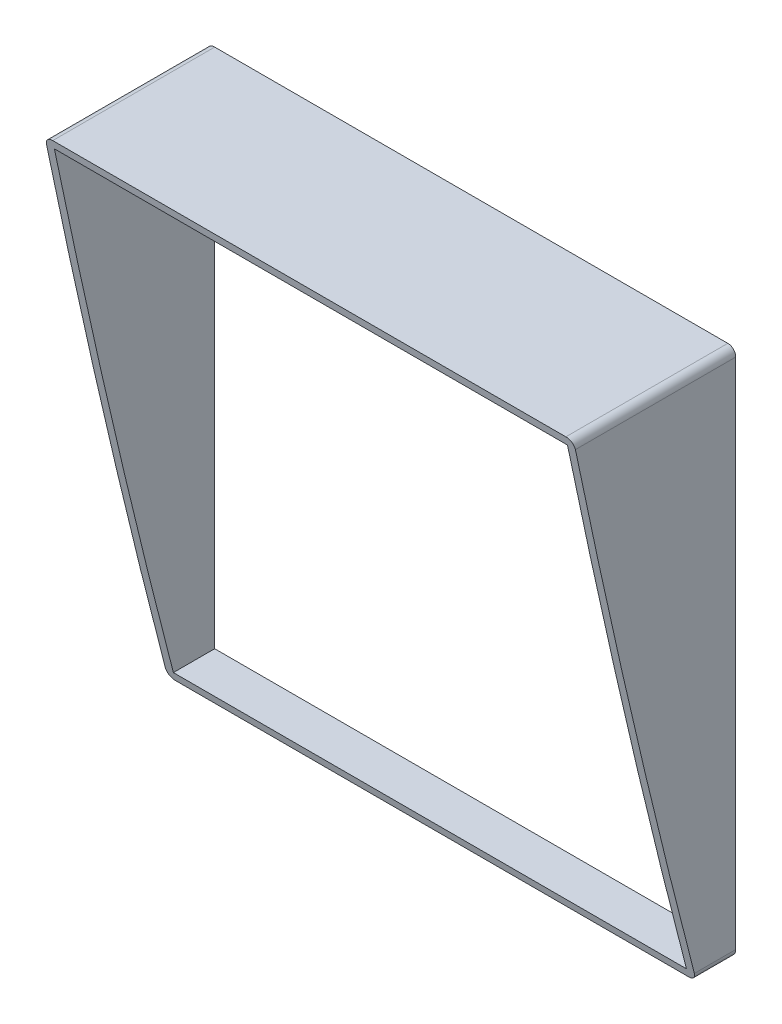
ISO-10303-21;
HEADER;
FILE_DESCRIPTION(('STEP AP214'),'2;1');
FILE_NAME('part.step','',(''),(''),'','','');
FILE_SCHEMA(('AUTOMOTIVE_DESIGN { 1 0 10303 214 1 1 1 1 }'));
ENDSEC;
DATA;
#1=APPLICATION_CONTEXT('core data for automotive mechanical design processes');
#2=APPLICATION_PROTOCOL_DEFINITION('international standard','automotive_design',2000,#1);
#3=PRODUCT_CONTEXT('',#1,'mechanical');
#4=PRODUCT('Part','Part','',(#3));
#5=PRODUCT_RELATED_PRODUCT_CATEGORY('part','',(#4));
#6=PRODUCT_DEFINITION_FORMATION('','',#4);
#7=PRODUCT_DEFINITION_CONTEXT('part definition',#1,'design');
#8=PRODUCT_DEFINITION('design','',#6,#7);
#9=PRODUCT_DEFINITION_SHAPE('','',#8);
#10=(LENGTH_UNIT() NAMED_UNIT(*) SI_UNIT(.MILLI.,.METRE.));
#11=(NAMED_UNIT(*) PLANE_ANGLE_UNIT() SI_UNIT($,.RADIAN.));
#12=(NAMED_UNIT(*) SI_UNIT($,.STERADIAN.) SOLID_ANGLE_UNIT());
#13=UNCERTAINTY_MEASURE_WITH_UNIT(LENGTH_MEASURE(1.E-05),#10,'distance_accuracy_value','');
#14=(GEOMETRIC_REPRESENTATION_CONTEXT(3) GLOBAL_UNCERTAINTY_ASSIGNED_CONTEXT((#13)) GLOBAL_UNIT_ASSIGNED_CONTEXT((#10,
#11,#12)) REPRESENTATION_CONTEXT('',''));
#15=CARTESIAN_POINT('',(0.,0.,0.));
#16=DIRECTION('',(0.,0.,1.));
#17=DIRECTION('',(1.,0.,0.));
#18=AXIS2_PLACEMENT_3D('',#15,#16,#17);
#19=CARTESIAN_POINT('',(-97.,97.,0.));
#20=DIRECTION('',(0.,0.,1.));
#21=DIRECTION('',(1.,0.,0.));
#22=AXIS2_PLACEMENT_3D('',#19,#20,#21);
#23=PLANE('',#22);
#24=CARTESIAN_POINT('',(-97.,97.,0.));
#25=DIRECTION('',(0.,0.,1.));
#26=DIRECTION('',(1.,0.,0.));
#27=AXIS2_PLACEMENT_3D('',#24,#25,#26);
#28=CIRCLE('',#27,3.);
#29=CARTESIAN_POINT('',(-97.,100.,0.));
#30=VERTEX_POINT('',#29);
#31=CARTESIAN_POINT('',(-100.,97.,0.));
#32=VERTEX_POINT('',#31);
#33=EDGE_CURVE('E206',#30,#32,#28,.T.);
#34=ORIENTED_EDGE('',*,*,#33,.F.);
#35=DIRECTION('',(-1.,0.,0.));
#36=VECTOR('',#35,1.);
#37=CARTESIAN_POINT('',(97.,100.,0.));
#38=LINE('',#37,#36);
#39=CARTESIAN_POINT('',(97.,100.,0.));
#40=VERTEX_POINT('',#39);
#41=EDGE_CURVE('E161',#40,#30,#38,.T.);
#42=ORIENTED_EDGE('',*,*,#41,.F.);
#43=CARTESIAN_POINT('',(97.,97.,0.));
#44=DIRECTION('',(0.,0.,1.));
#45=DIRECTION('',(1.,0.,0.));
#46=AXIS2_PLACEMENT_3D('',#43,#44,#45);
#47=CIRCLE('',#46,3.);
#48=CARTESIAN_POINT('',(100.,97.,0.));
#49=VERTEX_POINT('',#48);
#50=EDGE_CURVE('E200',#49,#40,#47,.T.);
#51=ORIENTED_EDGE('',*,*,#50,.F.);
#52=DIRECTION('',(0.,1.,0.));
#53=VECTOR('',#52,1.);
#54=CARTESIAN_POINT('',(100.,-97.,0.));
#55=LINE('',#54,#53);
#56=CARTESIAN_POINT('',(100.,-97.,0.));
#57=VERTEX_POINT('',#56);
#58=EDGE_CURVE('E196',#57,#49,#55,.T.);
#59=ORIENTED_EDGE('',*,*,#58,.F.);
#60=CARTESIAN_POINT('',(97.,-97.,0.));
#61=DIRECTION('',(0.,0.,1.));
#62=DIRECTION('',(1.,0.,0.));
#63=AXIS2_PLACEMENT_3D('',#60,#61,#62);
#64=CIRCLE('',#63,3.);
#65=CARTESIAN_POINT('',(97.,-100.,0.));
#66=VERTEX_POINT('',#65);
#67=EDGE_CURVE('E192',#66,#57,#64,.T.);
#68=ORIENTED_EDGE('',*,*,#67,.F.);
#69=DIRECTION('',(1.,0.,0.));
#70=VECTOR('',#69,1.);
#71=CARTESIAN_POINT('',(-97.,-100.,0.));
#72=LINE('',#71,#70);
#73=CARTESIAN_POINT('',(-97.,-100.,0.));
#74=VERTEX_POINT('',#73);
#75=EDGE_CURVE('E188',#74,#66,#72,.T.);
#76=ORIENTED_EDGE('',*,*,#75,.F.);
#77=CARTESIAN_POINT('',(-97.,-97.,0.));
#78=DIRECTION('',(0.,0.,1.));
#79=DIRECTION('',(1.,0.,0.));
#80=AXIS2_PLACEMENT_3D('',#77,#78,#79);
#81=CIRCLE('',#80,3.);
#82=CARTESIAN_POINT('',(-100.,-97.,0.));
#83=VERTEX_POINT('',#82);
#84=EDGE_CURVE('E184',#83,#74,#81,.T.);
#85=ORIENTED_EDGE('',*,*,#84,.F.);
#86=DIRECTION('',(0.,-1.,0.));
#87=VECTOR('',#86,1.);
#88=CARTESIAN_POINT('',(-100.,97.,0.));
#89=LINE('',#88,#87);
#90=EDGE_CURVE('E180',#32,#83,#89,.T.);
#91=ORIENTED_EDGE('',*,*,#90,.F.);
#92=EDGE_LOOP('',(#34,#42,#51,#59,#68,#76,#85,#91));
#93=FACE_BOUND('',#92,.T.);
#94=DIRECTION('',(0.,-1.,0.));
#95=VECTOR('',#94,1.);
#96=CARTESIAN_POINT('',(-97.,97.,0.));
#97=LINE('',#96,#95);
#98=CARTESIAN_POINT('',(-97.,97.,0.));
#99=VERTEX_POINT('',#98);
#100=CARTESIAN_POINT('',(-97.,-97.,0.));
#101=VERTEX_POINT('',#100);
#102=EDGE_CURVE('E157',#99,#101,#97,.T.);
#103=ORIENTED_EDGE('',*,*,#102,.T.);
#104=DIRECTION('',(1.,0.,0.));
#105=VECTOR('',#104,1.);
#106=CARTESIAN_POINT('',(-97.,-97.,0.));
#107=LINE('',#106,#105);
#108=CARTESIAN_POINT('',(97.,-97.,0.));
#109=VERTEX_POINT('',#108);
#110=EDGE_CURVE('E164',#101,#109,#107,.T.);
#111=ORIENTED_EDGE('',*,*,#110,.T.);
#112=DIRECTION('',(0.,1.,0.));
#113=VECTOR('',#112,1.);
#114=CARTESIAN_POINT('',(97.,-97.,0.));
#115=LINE('',#114,#113);
#116=CARTESIAN_POINT('',(97.,97.,0.));
#117=VERTEX_POINT('',#116);
#118=EDGE_CURVE('E168',#109,#117,#115,.T.);
#119=ORIENTED_EDGE('',*,*,#118,.T.);
#120=DIRECTION('',(-1.,0.,0.));
#121=VECTOR('',#120,1.);
#122=CARTESIAN_POINT('',(97.,97.,0.));
#123=LINE('',#122,#121);
#124=EDGE_CURVE('E171',#117,#99,#123,.T.);
#125=ORIENTED_EDGE('',*,*,#124,.T.);
#126=EDGE_LOOP('',(#103,#111,#119,#125));
#127=FACE_BOUND('',#126,.T.);
#128=ADVANCED_FACE('F75',(#93,#127),#23,.F.);
#129=CARTESIAN_POINT('',(-97.,97.,233.360213599289));
#130=DIRECTION('',(0.,0.,-1.));
#131=DIRECTION('',(-1.,0.,0.));
#132=AXIS2_PLACEMENT_3D('',#129,#130,#131);
#133=CYLINDRICAL_SURFACE('',#132,3.);
#134=DIRECTION('',(0.,0.,-1.));
#135=VECTOR('',#134,1.);
#136=CARTESIAN_POINT('',(-100.,97.,233.360213599289));
#137=LINE('',#136,#135);
#138=CARTESIAN_POINT('',(-100.,97.0000000015854,60.6130762424719));
#139=VERTEX_POINT('',#138);
#140=EDGE_CURVE('E178',#139,#32,#137,.T.);
#141=ORIENTED_EDGE('',*,*,#140,.F.);
#142=CARTESIAN_POINT('',(-100.,97.,60.6130762421445));
#143=CARTESIAN_POINT('',(-100.000007100054,97.0856880026168,60.6307707751174));
#144=CARTESIAN_POINT('',(-99.9963287509131,97.1713732623864,60.6484621380416));
#145=CARTESIAN_POINT('',(-99.9816560796996,97.3421414551059,60.6837154599153));
#146=CARTESIAN_POINT('',(-99.9706617978497,97.4272243913647,60.7012774195757));
#147=CARTESIAN_POINT('',(-99.9414142967146,97.5961798555819,60.7361465513628));
#148=CARTESIAN_POINT('',(-99.9231621255235,97.6800525564959,60.7534537599033));
#149=CARTESIAN_POINT('',(-99.8795302255661,97.8459754505165,60.7876873670131));
#150=CARTESIAN_POINT('',(-99.8541506421178,97.9280256807439,60.8046137733386));
#151=CARTESIAN_POINT('',(-99.7674816393416,98.1706801868427,60.8546649831489));
#152=CARTESIAN_POINT('',(-99.6956564207911,98.3278202419441,60.8870683739158));
#153=CARTESIAN_POINT('',(-99.525885414694,98.6277678277151,60.9489046485199));
#154=CARTESIAN_POINT('',(-99.4279487932262,98.7705803637144,60.9783385697639));
#155=CARTESIAN_POINT('',(-99.2096127536016,99.0363903607402,61.0331109183102));
#156=CARTESIAN_POINT('',(-99.0894432692385,99.1595685676855,61.058486711257));
#157=CARTESIAN_POINT('',(-98.8292827857296,99.3839527654858,61.1047038732665));
#158=CARTESIAN_POINT('',(-98.6892888505607,99.4851554961139,61.1255445695146));
#159=CARTESIAN_POINT('',(-98.3964455527121,99.6605469856351,61.16165830404));
#160=CARTESIAN_POINT('',(-98.2439027497817,99.7352273616381,61.177032672776));
#161=CARTESIAN_POINT('',(-97.9280637731349,99.8578542143945,61.2022756745486));
#162=CARTESIAN_POINT('',(-97.7647772858595,99.9058244133696,61.212149193083));
#163=CARTESIAN_POINT('',(-97.5001599770955,99.9597244006013,61.2232428326046));
#164=CARTESIAN_POINT('',(-97.4006830354952,99.9748193261081,61.2263495344302));
#165=CARTESIAN_POINT('',(-97.200819910882,99.9949540541081,61.2304934197249));
#166=CARTESIAN_POINT('',(-97.1004352519509,100.000008375793,61.2315335914952));
#167=CARTESIAN_POINT('',(-97.0000000000001,100.,61.2315319001184));
#168=B_SPLINE_CURVE_WITH_KNOTS('',3,(#142,#143,#144,#145,#146,#147,#148,#149,#150,#151,#152,
#153,#154,#155,#156,#157,#158,#159,#160,#161,#162,#163,#164,#165,#166,#167),.UNSPECIFIED.,.F.,
.F.,(4,2,2,2,2,2,2,2,2,2,2,2,4),(0.,0.262404202490615,0.524806962316488,0.787171842958766,
1.04953137474283,1.57415237436955,2.09858945433025,2.61787860807826,3.13724474971434,
3.64640829512043,4.15511891072351,4.45662961662765,4.75770400537536),.UNSPECIFIED.);
#169=CARTESIAN_POINT('',(-97.0000000000001,99.9999999999999,61.2315319001184));
#170=VERTEX_POINT('',#169);
#171=EDGE_CURVE('E97',#139,#170,#168,.T.);
#172=ORIENTED_EDGE('',*,*,#171,.T.);
#173=DIRECTION('',(0.,0.,-1.));
#174=VECTOR('',#173,1.);
#175=CARTESIAN_POINT('',(-97.,100.,233.360213599289));
#176=LINE('',#175,#174);
#177=EDGE_CURVE('E205',#170,#30,#176,.T.);
#178=ORIENTED_EDGE('',*,*,#177,.T.);
#179=ORIENTED_EDGE('',*,*,#33,.T.);
#180=EDGE_LOOP('',(#141,#172,#178,#179));
#181=FACE_BOUND('',#180,.T.);
#182=ADVANCED_FACE('F222',(#181),#133,.T.);
#183=CARTESIAN_POINT('',(-100.,97.,233.360213599289));
#184=DIRECTION('',(1.,0.,0.));
#185=DIRECTION('',(0.,1.,0.));
#186=AXIS2_PLACEMENT_3D('',#183,#184,#185);
#187=PLANE('',#186);
#188=DIRECTION('',(0.,0.,-1.));
#189=VECTOR('',#188,1.);
#190=CARTESIAN_POINT('',(-100.,-97.,233.360213599289));
#191=LINE('',#190,#189);
#192=CARTESIAN_POINT('',(-100.,-97.,15.6242073781726));
#193=VERTEX_POINT('',#192);
#194=EDGE_CURVE('E182',#193,#83,#191,.T.);
#195=ORIENTED_EDGE('',*,*,#194,.F.);
#196=CARTESIAN_POINT('',(-100.,821.32936142745,227.601217320556));
#197=CARTESIAN_POINT('',(-100.,814.013340356773,232.250751676992));
#198=CARTESIAN_POINT('',(-100.,807.890062740785,233.357963599289));
#199=CARTESIAN_POINT('',(-100.,752.770792852457,214.336934546945));
#200=CARTESIAN_POINT('',(-100.,674.079077361076,175.267095142982));
#201=CARTESIAN_POINT('',(-100.,488.513772650182,127.413622560773));
#202=CARTESIAN_POINT('',(-100.,166.664225990946,81.1075939794665));
#203=CARTESIAN_POINT('',(-100.,-207.087491188463,0.397268381274574));
#204=CARTESIAN_POINT('',(-100.,-425.4,-93.8780602923125));
#205=B_SPLINE_CURVE_WITH_KNOTS('',3,(#196,#197,#198,#199,#200,#201,#202,#203,#204),
.UNSPECIFIED.,.F.,.F.,(4,1,1,1,1,1,4),(0.,0.0188245230898064,0.0375633418946969,
0.170740982920659,0.210775946768388,0.421265775243738,1.),.UNSPECIFIED.);
#206=EDGE_CURVE('E181',#193,#139,#205,.F.);
#207=ORIENTED_EDGE('',*,*,#206,.T.);
#208=ORIENTED_EDGE('',*,*,#140,.T.);
#209=ORIENTED_EDGE('',*,*,#90,.T.);
#210=EDGE_LOOP('',(#195,#207,#208,#209));
#211=FACE_BOUND('',#210,.T.);
#212=ADVANCED_FACE('F227',(#211),#187,.F.);
#213=CARTESIAN_POINT('',(-97.,-97.,233.360213599289));
#214=DIRECTION('',(0.,0.,-1.));
#215=DIRECTION('',(-1.,0.,0.));
#216=AXIS2_PLACEMENT_3D('',#213,#214,#215);
#217=CYLINDRICAL_SURFACE('',#216,3.);
#218=DIRECTION('',(0.,0.,-1.));
#219=VECTOR('',#218,1.);
#220=CARTESIAN_POINT('',(-97.,-100.,233.360213599289));
#221=LINE('',#220,#219);
#222=CARTESIAN_POINT('',(-97.0000000000001,-100.,14.8408458443054));
#223=VERTEX_POINT('',#222);
#224=EDGE_CURVE('E186',#223,#74,#221,.T.);
#225=ORIENTED_EDGE('',*,*,#224,.F.);
#226=CARTESIAN_POINT('',(-97.,-100.,14.8408458443055));
#227=CARTESIAN_POINT('',(-97.082392301401,-100.000009490196,14.8408433369679));
#228=CARTESIAN_POINT('',(-97.1647799083764,-99.9966058700731,14.8417338347966));
#229=CARTESIAN_POINT('',(-97.3289500804342,-99.9830455162141,14.8452815366397));
#230=CARTESIAN_POINT('',(-97.4107327132783,-99.9728895507387,14.8479385396668));
#231=CARTESIAN_POINT('',(-97.5729818090605,-99.9459199372928,14.8549941075903));
#232=CARTESIAN_POINT('',(-97.653450227733,-99.9291173450635,14.8593897804499));
#233=CARTESIAN_POINT('',(-97.8126148061725,-99.8890140831846,14.8698805877941));
#234=CARTESIAN_POINT('',(-97.8913109651344,-99.8657134105828,14.8759757230509));
#235=CARTESIAN_POINT('',(-98.1239374649887,-99.7863142304628,14.8967442836812));
#236=CARTESIAN_POINT('',(-98.2745259116123,-99.7206984069387,14.9139061375583));
#237=CARTESIAN_POINT('',(-98.5623117630588,-99.5662999868688,14.9542821334835));
#238=CARTESIAN_POINT('',(-98.6995080520835,-99.4775154622299,14.9774967792432));
#239=CARTESIAN_POINT('',(-98.9589197399221,-99.2781034043576,15.0296262744241));
#240=CARTESIAN_POINT('',(-99.0808981985866,-99.1671871446118,15.0586164617199));
#241=CARTESIAN_POINT('',(-99.3045872820295,-98.9276287373059,15.1212141384857));
#242=CARTESIAN_POINT('',(-99.406293038356,-98.798982344403,15.154822733792));
#243=CARTESIAN_POINT('',(-99.5898864424123,-98.5233987424396,15.2267983210333));
#244=CARTESIAN_POINT('',(-99.6710641423571,-98.3760189984249,15.2652803046912));
#245=CARTESIAN_POINT('',(-99.8075179427542,-98.0704352397623,15.3450459630727));
#246=CARTESIAN_POINT('',(-99.8627975511805,-97.912232694424,15.3863292574828));
#247=CARTESIAN_POINT('',(-99.9362520818087,-97.6280958586719,15.4604515884955));
#248=CARTESIAN_POINT('',(-99.9601441447508,-97.5035136825579,15.4929434882032));
#249=CARTESIAN_POINT('',(-99.9920186416349,-97.2526331975978,15.5583589698145));
#250=CARTESIAN_POINT('',(-100.000023559898,-97.1263375691372,15.5912818751695));
#251=CARTESIAN_POINT('',(-100.,-97.,15.6242073781726));
#252=B_SPLINE_CURVE_WITH_KNOTS('',3,(#226,#227,#228,#229,#230,#231,#232,#233,#234,#235,#236,
#237,#238,#239,#240,#241,#242,#243,#244,#245,#246,#247,#248,#249,#250,#251),.UNSPECIFIED.,.F.,
.F.,(4,2,2,2,2,2,2,2,2,2,2,2,4),(0.,0.247093587719547,0.494159066725783,0.740815303101802,
0.987471651539334,1.48042332805695,1.97341604097017,2.47331895925039,2.97334178403566,
3.48882409732194,4.00423656678551,4.39613879672963,4.78748598942122),.UNSPECIFIED.);
#253=EDGE_CURVE('E185',#223,#193,#252,.T.);
#254=ORIENTED_EDGE('',*,*,#253,.T.);
#255=ORIENTED_EDGE('',*,*,#194,.T.);
#256=ORIENTED_EDGE('',*,*,#84,.T.);
#257=EDGE_LOOP('',(#225,#254,#255,#256));
#258=FACE_BOUND('',#257,.T.);
#259=ADVANCED_FACE('F346',(#258),#217,.T.);
#260=CARTESIAN_POINT('',(-97.,-100.,233.360213599289));
#261=DIRECTION('',(0.,1.,0.));
#262=DIRECTION('',(0.,0.,1.));
#263=AXIS2_PLACEMENT_3D('',#260,#261,#262);
#264=PLANE('',#263);
#265=DIRECTION('',(0.,0.,-1.));
#266=VECTOR('',#265,1.);
#267=CARTESIAN_POINT('',(97.,-100.,233.360213599289));
#268=LINE('',#267,#266);
#269=CARTESIAN_POINT('',(97.,-100.,14.8408458443055));
#270=VERTEX_POINT('',#269);
#271=EDGE_CURVE('E190',#270,#66,#268,.T.);
#272=ORIENTED_EDGE('',*,*,#271,.F.);
#273=DIRECTION('',(-1.,0.,0.));
#274=VECTOR('',#273,1.);
#275=CARTESIAN_POINT('',(0.,-100.,14.8408458443054));
#276=LINE('',#275,#274);
#277=EDGE_CURVE('E189',#270,#223,#276,.T.);
#278=ORIENTED_EDGE('',*,*,#277,.T.);
#279=ORIENTED_EDGE('',*,*,#224,.T.);
#280=ORIENTED_EDGE('',*,*,#75,.T.);
#281=EDGE_LOOP('',(#272,#278,#279,#280));
#282=FACE_BOUND('',#281,.T.);
#283=ADVANCED_FACE('F344',(#282),#264,.F.);
#284=CARTESIAN_POINT('',(97.,-97.,233.360213599289));
#285=DIRECTION('',(0.,0.,-1.));
#286=DIRECTION('',(-1.,0.,0.));
#287=AXIS2_PLACEMENT_3D('',#284,#285,#286);
#288=CYLINDRICAL_SURFACE('',#287,3.);
#289=DIRECTION('',(0.,0.,-1.));
#290=VECTOR('',#289,1.);
#291=CARTESIAN_POINT('',(100.,-97.,233.360213599289));
#292=LINE('',#291,#290);
#293=CARTESIAN_POINT('',(99.9999999999999,-97.0000000029362,15.6242073774073));
#294=VERTEX_POINT('',#293);
#295=EDGE_CURVE('E194',#294,#57,#292,.T.);
#296=ORIENTED_EDGE('',*,*,#295,.F.);
#297=CARTESIAN_POINT('',(100.,-97.,15.6242073781726));
#298=CARTESIAN_POINT('',(100.000006492503,-97.0864954464646,15.6016652732155));
#299=CARTESIAN_POINT('',(99.9962592013464,-97.1729869554062,15.5791203601685));
#300=CARTESIAN_POINT('',(99.9813082142559,-97.3453640758507,15.5341810346435));
#301=CARTESIAN_POINT('',(99.9701043895374,-97.4312496768629,15.5117866247716));
#302=CARTESIAN_POINT('',(99.9402882521572,-97.6018325179434,15.467300364239));
#303=CARTESIAN_POINT('',(99.921674325267,-97.6865294949154,15.4452085805882));
#304=CARTESIAN_POINT('',(99.8771627053963,-97.8540837243244,15.401497876626));
#305=CARTESIAN_POINT('',(99.8512651913195,-97.9369410218947,15.3798789447142));
#306=CARTESIAN_POINT('',(99.7627864775551,-98.1819992478645,15.3159289072289));
#307=CARTESIAN_POINT('',(99.6894169837518,-98.3406986427169,15.2745013955485));
#308=CARTESIAN_POINT('',(99.5158186015368,-98.6435135609017,15.1954311195241));
#309=CARTESIAN_POINT('',(99.4156018471881,-98.7876356322583,15.1577866559125));
#310=CARTESIAN_POINT('',(99.192614687147,-99.0548048008822,15.0879854174616));
#311=CARTESIAN_POINT('',(99.0702238668954,-99.1781477595502,15.0557516324786));
#312=CARTESIAN_POINT('',(98.8051189773957,-99.4024327535476,14.9971266269117));
#313=CARTESIAN_POINT('',(98.662402661511,-99.5033723094035,14.9707360530201));
#314=CARTESIAN_POINT('',(98.3655563277829,-99.6765401554903,14.9254547931294));
#315=CARTESIAN_POINT('',(98.2119255340124,-99.7495705902181,14.9063545959361));
#316=CARTESIAN_POINT('',(97.8939698419028,-99.8687213924199,14.8751893832268));
#317=CARTESIAN_POINT('',(97.7296566317682,-99.9148706390132,14.8631168177626));
#318=CARTESIAN_POINT('',(97.469920894112,-99.9644743536439,14.8501400983555));
#319=CARTESIAN_POINT('',(97.3764003233928,-99.9777897135211,14.8466565613292));
#320=CARTESIAN_POINT('',(97.18860218304,-99.9955487321418,14.8420104118401));
#321=CARTESIAN_POINT('',(97.0943259236797,-100.000005364093,14.8408444054583));
#322=CARTESIAN_POINT('',(97.,-99.9999999999999,14.8408458443055));
#323=B_SPLINE_CURVE_WITH_KNOTS('',3,(#297,#298,#299,#300,#301,#302,#303,#304,#305,#306,#307,
#308,#309,#310,#311,#312,#313,#314,#315,#316,#317,#318,#319,#320,#321,#322),.UNSPECIFIED.,.F.,
.F.,(4,2,2,2,2,2,2,2,2,2,2,2,4),(0.,0.26806947746696,0.536143584972862,0.804276122151919,
1.07240207387375,1.6086163065243,2.14458859597983,2.67212963302886,3.19972902605742,
3.71075865870553,4.22123826225042,4.50442128557257,4.78718929367573),.UNSPECIFIED.);
#324=EDGE_CURVE('E193',#294,#270,#323,.T.);
#325=ORIENTED_EDGE('',*,*,#324,.T.);
#326=ORIENTED_EDGE('',*,*,#271,.T.);
#327=ORIENTED_EDGE('',*,*,#67,.T.);
#328=EDGE_LOOP('',(#296,#325,#326,#327));
#329=FACE_BOUND('',#328,.T.);
#330=ADVANCED_FACE('F340',(#329),#288,.T.);
#331=CARTESIAN_POINT('',(100.,-97.,233.360213599289));
#332=DIRECTION('',(-1.,0.,0.));
#333=DIRECTION('',(0.,-1.,0.));
#334=AXIS2_PLACEMENT_3D('',#331,#332,#333);
#335=PLANE('',#334);
#336=DIRECTION('',(0.,0.,-1.));
#337=VECTOR('',#336,1.);
#338=CARTESIAN_POINT('',(100.,97.,233.360213599289));
#339=LINE('',#338,#337);
#340=CARTESIAN_POINT('',(99.9999999999999,97.,60.6130762421445));
#341=VERTEX_POINT('',#340);
#342=EDGE_CURVE('E198',#341,#49,#339,.T.);
#343=ORIENTED_EDGE('',*,*,#342,.F.);
#344=CARTESIAN_POINT('',(99.9999999999998,821.32936142745,227.601217320556));
#345=CARTESIAN_POINT('',(99.9999999999998,814.013340356773,232.250751676992));
#346=CARTESIAN_POINT('',(99.9999999999998,807.890062740785,233.357963599289));
#347=CARTESIAN_POINT('',(99.9999999999998,752.770792852457,214.336934546945));
#348=CARTESIAN_POINT('',(99.9999999999998,674.079077361076,175.267095142982));
#349=CARTESIAN_POINT('',(99.9999999999998,488.513772650182,127.413622560773));
#350=CARTESIAN_POINT('',(99.9999999999998,166.664225990946,81.1075939794665));
#351=CARTESIAN_POINT('',(99.9999999999999,-207.087491188463,0.397268381274574));
#352=CARTESIAN_POINT('',(99.9999999999999,-425.4,-93.8780602923125));
#353=B_SPLINE_CURVE_WITH_KNOTS('',3,(#344,#345,#346,#347,#348,#349,#350,#351,#352),
.UNSPECIFIED.,.F.,.F.,(4,1,1,1,1,1,4),(0.,0.0188245230898064,0.0375633418946969,
0.170740982920659,0.210775946768388,0.421265775243738,1.),.UNSPECIFIED.);
#354=EDGE_CURVE('E197',#341,#294,#353,.T.);
#355=ORIENTED_EDGE('',*,*,#354,.T.);
#356=ORIENTED_EDGE('',*,*,#295,.T.);
#357=ORIENTED_EDGE('',*,*,#58,.T.);
#358=EDGE_LOOP('',(#343,#355,#356,#357));
#359=FACE_BOUND('',#358,.T.);
#360=ADVANCED_FACE('F257',(#359),#335,.F.);
#361=CARTESIAN_POINT('',(97.,97.,233.360213599289));
#362=DIRECTION('',(0.,0.,-1.));
#363=DIRECTION('',(-1.,0.,0.));
#364=AXIS2_PLACEMENT_3D('',#361,#362,#363);
#365=CYLINDRICAL_SURFACE('',#364,3.);
#366=DIRECTION('',(0.,0.,-1.));
#367=VECTOR('',#366,1.);
#368=CARTESIAN_POINT('',(97.,100.,233.360213599289));
#369=LINE('',#368,#367);
#370=CARTESIAN_POINT('',(97.,100.,61.2315319001185));
#371=VERTEX_POINT('',#370);
#372=EDGE_CURVE('E202',#371,#40,#369,.T.);
#373=ORIENTED_EDGE('',*,*,#372,.F.);
#374=CARTESIAN_POINT('',(97.,100.,61.2315319001184));
#375=CARTESIAN_POINT('',(97.0831224657888,100.000008987514,61.2315337324498));
#376=CARTESIAN_POINT('',(97.1662405610942,99.9965454123548,61.2308209277612));
#377=CARTESIAN_POINT('',(97.3318723384336,99.9827424667997,61.2279801870044));
#378=CARTESIAN_POINT('',(97.4143860736197,99.9724037085864,61.2258523769315));
#379=CARTESIAN_POINT('',(97.5781198058384,99.9449379319452,61.2201995149477));
#380=CARTESIAN_POINT('',(97.6593413737503,99.9278199358752,61.216676320127));
#381=CARTESIAN_POINT('',(97.8200016999086,99.8869495410974,61.208264108728));
#382=CARTESIAN_POINT('',(97.8994404658761,99.8631971711288,61.2033750980662));
#383=CARTESIAN_POINT('',(98.1342882224438,99.7822200471977,61.1867065371339));
#384=CARTESIAN_POINT('',(98.2863294427424,99.7152582386181,61.172921951423));
#385=CARTESIAN_POINT('',(98.576820776279,99.5575371132249,61.1404488865457));
#386=CARTESIAN_POINT('',(98.715271061502,99.4667780976039,61.1217604694452));
#387=CARTESIAN_POINT('',(98.9761804482698,99.2632523039286,61.0798439921657));
#388=CARTESIAN_POINT('',(99.0984862786555,99.1502968646194,61.0565770133532));
#389=CARTESIAN_POINT('',(99.3224627518888,98.9062052831485,61.0062869243345));
#390=CARTESIAN_POINT('',(99.4241287130072,98.7750650274638,60.9792629642712));
#391=CARTESIAN_POINT('',(99.6060449472278,98.4956174015011,60.9216631832634));
#392=CARTESIAN_POINT('',(99.685837013946,98.3470242174196,60.8910281859818));
#393=CARTESIAN_POINT('',(99.8193257543829,98.0390149493024,60.8275096489602));
#394=CARTESIAN_POINT('',(99.8730301384007,97.8796020789546,60.7946267768683));
#395=CARTESIAN_POINT('',(99.9419430766247,97.5996673119785,60.7368669933999));
#396=CARTESIAN_POINT('',(99.9637018980846,97.4806475537353,60.7123044566271));
#397=CARTESIAN_POINT('',(99.9927301782327,97.2410981598814,60.6628577725111));
#398=CARTESIAN_POINT('',(100.000020102375,97.1205708998927,60.6379741296047));
#399=CARTESIAN_POINT('',(100.,97.0000000000001,60.6130762421445));
#400=B_SPLINE_CURVE_WITH_KNOTS('',3,(#374,#375,#376,#377,#378,#379,#380,#381,#382,#383,#384,
#385,#386,#387,#388,#389,#390,#391,#392,#393,#394,#395,#396,#397,#398,#399),.UNSPECIFIED.,.F.,
.F.,(4,2,2,2,2,2,2,2,2,2,2,2,4),(0.,0.249284473710586,0.498546753520265,0.747478403797993,
0.996408975762088,1.49396719978688,1.99151912670219,2.49349880684254,2.9955922238288,
3.50751486805476,4.01928611969083,4.38884913927847,4.75788905884878),.UNSPECIFIED.);
#401=EDGE_CURVE('E201',#371,#341,#400,.T.);
#402=ORIENTED_EDGE('',*,*,#401,.T.);
#403=ORIENTED_EDGE('',*,*,#342,.T.);
#404=ORIENTED_EDGE('',*,*,#50,.T.);
#405=EDGE_LOOP('',(#373,#402,#403,#404));
#406=FACE_BOUND('',#405,.T.);
#407=ADVANCED_FACE('F244',(#406),#365,.T.);
#408=CARTESIAN_POINT('',(97.,100.,233.360213599289));
#409=DIRECTION('',(0.,-1.,0.));
#410=DIRECTION('',(0.,0.,-1.));
#411=AXIS2_PLACEMENT_3D('',#408,#409,#410);
#412=PLANE('',#411);
#413=ORIENTED_EDGE('',*,*,#177,.F.);
#414=DIRECTION('',(-1.,0.,0.));
#415=VECTOR('',#414,1.);
#416=CARTESIAN_POINT('',(0.,99.9999999999999,61.2315319001184));
#417=LINE('',#416,#415);
#418=EDGE_CURVE('E204',#170,#371,#417,.F.);
#419=ORIENTED_EDGE('',*,*,#418,.T.);
#420=ORIENTED_EDGE('',*,*,#372,.T.);
#421=ORIENTED_EDGE('',*,*,#41,.T.);
#422=EDGE_LOOP('',(#413,#419,#420,#421));
#423=FACE_BOUND('',#422,.T.);
#424=ADVANCED_FACE('F240',(#423),#412,.F.);
#425=CARTESIAN_POINT('',(-97.,97.,233.360213599289));
#426=DIRECTION('',(1.,0.,0.));
#427=DIRECTION('',(0.,1.,0.));
#428=AXIS2_PLACEMENT_3D('',#425,#426,#427);
#429=PLANE('',#428);
#430=CARTESIAN_POINT('',(-97.0000000000003,821.32936142745,227.601217320556));
#431=CARTESIAN_POINT('',(-97.0000000000003,814.013340356773,232.250751676992));
#432=CARTESIAN_POINT('',(-97.0000000000003,807.890062740785,233.357963599289));
#433=CARTESIAN_POINT('',(-97.0000000000003,752.770792852457,214.336934546945));
#434=CARTESIAN_POINT('',(-97.0000000000003,674.079077361076,175.267095142982));
#435=CARTESIAN_POINT('',(-97.0000000000003,488.513772650182,127.413622560773));
#436=CARTESIAN_POINT('',(-97.0000000000003,166.664225990946,81.1075939794665));
#437=CARTESIAN_POINT('',(-97.0000000000002,-207.087491188463,0.397268381274574));
#438=CARTESIAN_POINT('',(-97.0000000000002,-425.4,-93.8780602923125));
#439=B_SPLINE_CURVE_WITH_KNOTS('',3,(#430,#431,#432,#433,#434,#435,#436,#437,#438),
.UNSPECIFIED.,.F.,.F.,(4,1,1,1,1,1,4),(0.,0.0188245230898064,0.0375633418946969,
0.170740982920659,0.210775946768388,0.421265775243738,1.),.UNSPECIFIED.);
#440=CARTESIAN_POINT('',(-97.0000000000001,-97.0000000000003,15.6242073781725));
#441=VERTEX_POINT('',#440);
#442=CARTESIAN_POINT('',(-97.,97.,60.6130762421445));
#443=VERTEX_POINT('',#442);
#444=EDGE_CURVE('E160',#441,#443,#439,.F.);
#445=ORIENTED_EDGE('',*,*,#444,.F.);
#446=DIRECTION('',(0.,0.,-1.));
#447=VECTOR('',#446,1.);
#448=CARTESIAN_POINT('',(-97.,-97.,233.360213599289));
#449=LINE('',#448,#447);
#450=EDGE_CURVE('E153',#441,#101,#449,.T.);
#451=ORIENTED_EDGE('',*,*,#450,.T.);
#452=ORIENTED_EDGE('',*,*,#102,.F.);
#453=DIRECTION('',(0.,0.,-1.));
#454=VECTOR('',#453,1.);
#455=CARTESIAN_POINT('',(-97.,97.,233.360213599289));
#456=LINE('',#455,#454);
#457=EDGE_CURVE('E211',#443,#99,#456,.T.);
#458=ORIENTED_EDGE('',*,*,#457,.F.);
#459=EDGE_LOOP('',(#445,#451,#452,#458));
#460=FACE_BOUND('',#459,.T.);
#461=ADVANCED_FACE('F154',(#460),#429,.T.);
#462=CARTESIAN_POINT('',(-97.,-97.,233.360213599289));
#463=DIRECTION('',(0.,1.,0.));
#464=DIRECTION('',(0.,0.,1.));
#465=AXIS2_PLACEMENT_3D('',#462,#463,#464);
#466=PLANE('',#465);
#467=DIRECTION('',(-1.,0.,0.));
#468=VECTOR('',#467,1.);
#469=CARTESIAN_POINT('',(0.,-97.0000000000003,15.6242073781725));
#470=LINE('',#469,#468);
#471=CARTESIAN_POINT('',(96.9999999999999,-97.0000000029364,15.6242073774073));
#472=VERTEX_POINT('',#471);
#473=EDGE_CURVE('E12',#472,#441,#470,.T.);
#474=ORIENTED_EDGE('',*,*,#473,.F.);
#475=DIRECTION('',(0.,0.,-1.));
#476=VECTOR('',#475,1.);
#477=CARTESIAN_POINT('',(97.,-97.,233.360213599289));
#478=LINE('',#477,#476);
#479=EDGE_CURVE('E146',#472,#109,#478,.T.);
#480=ORIENTED_EDGE('',*,*,#479,.T.);
#481=ORIENTED_EDGE('',*,*,#110,.F.);
#482=ORIENTED_EDGE('',*,*,#450,.F.);
#483=EDGE_LOOP('',(#474,#480,#481,#482));
#484=FACE_BOUND('',#483,.T.);
#485=ADVANCED_FACE('F165',(#484),#466,.T.);
#486=CARTESIAN_POINT('',(97.,-97.,233.360213599289));
#487=DIRECTION('',(-1.,0.,0.));
#488=DIRECTION('',(0.,-1.,0.));
#489=AXIS2_PLACEMENT_3D('',#486,#487,#488);
#490=PLANE('',#489);
#491=CARTESIAN_POINT('',(96.9999999999998,821.32936142745,227.601217320556));
#492=CARTESIAN_POINT('',(96.9999999999998,814.013340356773,232.250751676992));
#493=CARTESIAN_POINT('',(96.9999999999998,807.890062740785,233.357963599289));
#494=CARTESIAN_POINT('',(96.9999999999998,752.770792852457,214.336934546945));
#495=CARTESIAN_POINT('',(96.9999999999998,674.079077361076,175.267095142982));
#496=CARTESIAN_POINT('',(96.9999999999998,488.513772650182,127.413622560773));
#497=CARTESIAN_POINT('',(96.9999999999998,166.664225990946,81.1075939794665));
#498=CARTESIAN_POINT('',(96.9999999999999,-207.087491188463,0.397268381274574));
#499=CARTESIAN_POINT('',(96.9999999999999,-425.4,-93.8780602923125));
#500=B_SPLINE_CURVE_WITH_KNOTS('',3,(#491,#492,#493,#494,#495,#496,#497,#498,#499),
.UNSPECIFIED.,.F.,.F.,(4,1,1,1,1,1,4),(0.,0.0188245230898064,0.0375633418946969,
0.170740982920659,0.210775946768388,0.421265775243738,1.),.UNSPECIFIED.);
#501=CARTESIAN_POINT('',(97.,96.9999999999999,60.6130762421445));
#502=VERTEX_POINT('',#501);
#503=EDGE_CURVE('E88',#502,#472,#500,.T.);
#504=ORIENTED_EDGE('',*,*,#503,.F.);
#505=DIRECTION('',(0.,0.,-1.));
#506=VECTOR('',#505,1.);
#507=CARTESIAN_POINT('',(97.,97.,233.360213599289));
#508=LINE('',#507,#506);
#509=EDGE_CURVE('E209',#502,#117,#508,.T.);
#510=ORIENTED_EDGE('',*,*,#509,.T.);
#511=ORIENTED_EDGE('',*,*,#118,.F.);
#512=ORIENTED_EDGE('',*,*,#479,.F.);
#513=EDGE_LOOP('',(#504,#510,#511,#512));
#514=FACE_BOUND('',#513,.T.);
#515=ADVANCED_FACE('F233',(#514),#490,.T.);
#516=CARTESIAN_POINT('',(97.,97.,233.360213599289));
#517=DIRECTION('',(0.,-1.,0.));
#518=DIRECTION('',(0.,0.,-1.));
#519=AXIS2_PLACEMENT_3D('',#516,#517,#518);
#520=PLANE('',#519);
#521=DIRECTION('',(-1.,0.,0.));
#522=VECTOR('',#521,1.);
#523=CARTESIAN_POINT('',(0.,96.9999999999999,60.6130762421445));
#524=LINE('',#523,#522);
#525=EDGE_CURVE('E175',#443,#502,#524,.F.);
#526=ORIENTED_EDGE('',*,*,#525,.F.);
#527=ORIENTED_EDGE('',*,*,#457,.T.);
#528=ORIENTED_EDGE('',*,*,#124,.F.);
#529=ORIENTED_EDGE('',*,*,#509,.F.);
#530=EDGE_LOOP('',(#526,#527,#528,#529));
#531=FACE_BOUND('',#530,.T.);
#532=ADVANCED_FACE('F230',(#531),#520,.T.);
#533=CARTESIAN_POINT('',(300.,821.32936142745,227.601217320556));
#534=CARTESIAN_POINT('',(300.,814.013340356773,232.250751676992));
#535=CARTESIAN_POINT('',(300.,807.890062740785,233.357963599289));
#536=CARTESIAN_POINT('',(300.,752.770792852457,214.336934546945));
#537=CARTESIAN_POINT('',(300.,674.079077361076,175.267095142982));
#538=CARTESIAN_POINT('',(300.,488.513772650182,127.413622560773));
#539=CARTESIAN_POINT('',(300.,166.664225990946,81.1075939794665));
#540=CARTESIAN_POINT('',(300.,-207.087491188463,0.397268381274574));
#541=CARTESIAN_POINT('',(300.,-425.4,-93.8780602923125));
#542=B_SPLINE_CURVE_WITH_KNOTS('',3,(#533,#534,#535,#536,#537,#538,#539,#540,#541),
.UNSPECIFIED.,.F.,.F.,(4,1,1,1,1,1,4),(0.,0.0188245230898064,0.0375633418946969,
0.170740982920659,0.210775946768388,0.421265775243738,1.),.UNSPECIFIED.);
#543=DIRECTION('',(-1.,0.,0.));
#544=VECTOR('',#543,1.);
#545=SURFACE_OF_LINEAR_EXTRUSION('',#542,#544);
#546=ORIENTED_EDGE('',*,*,#444,.T.);
#547=ORIENTED_EDGE('',*,*,#525,.T.);
#548=ORIENTED_EDGE('',*,*,#503,.T.);
#549=ORIENTED_EDGE('',*,*,#473,.T.);
#550=EDGE_LOOP('',(#546,#547,#548,#549));
#551=FACE_BOUND('',#550,.T.);
#552=ORIENTED_EDGE('',*,*,#206,.F.);
#553=ORIENTED_EDGE('',*,*,#253,.F.);
#554=ORIENTED_EDGE('',*,*,#277,.F.);
#555=ORIENTED_EDGE('',*,*,#324,.F.);
#556=ORIENTED_EDGE('',*,*,#354,.F.);
#557=ORIENTED_EDGE('',*,*,#401,.F.);
#558=ORIENTED_EDGE('',*,*,#418,.F.);
#559=ORIENTED_EDGE('',*,*,#171,.F.);
#560=EDGE_LOOP('',(#552,#553,#554,#555,#556,#557,#558,#559));
#561=FACE_BOUND('',#560,.T.);
#562=ADVANCED_FACE('F77',(#551,#561),#545,.F.);
#563=CLOSED_SHELL('',(#128,#182,#212,#259,#283,#330,#360,#407,#424,#461,#485,#515,#532,#562));
#564=MANIFOLD_SOLID_BREP('B2',#563);
#565=ADVANCED_BREP_SHAPE_REPRESENTATION('',(#18,#564),#14);
#566=SHAPE_DEFINITION_REPRESENTATION(#9,#565);
ENDSEC;
END-ISO-10303-21;
